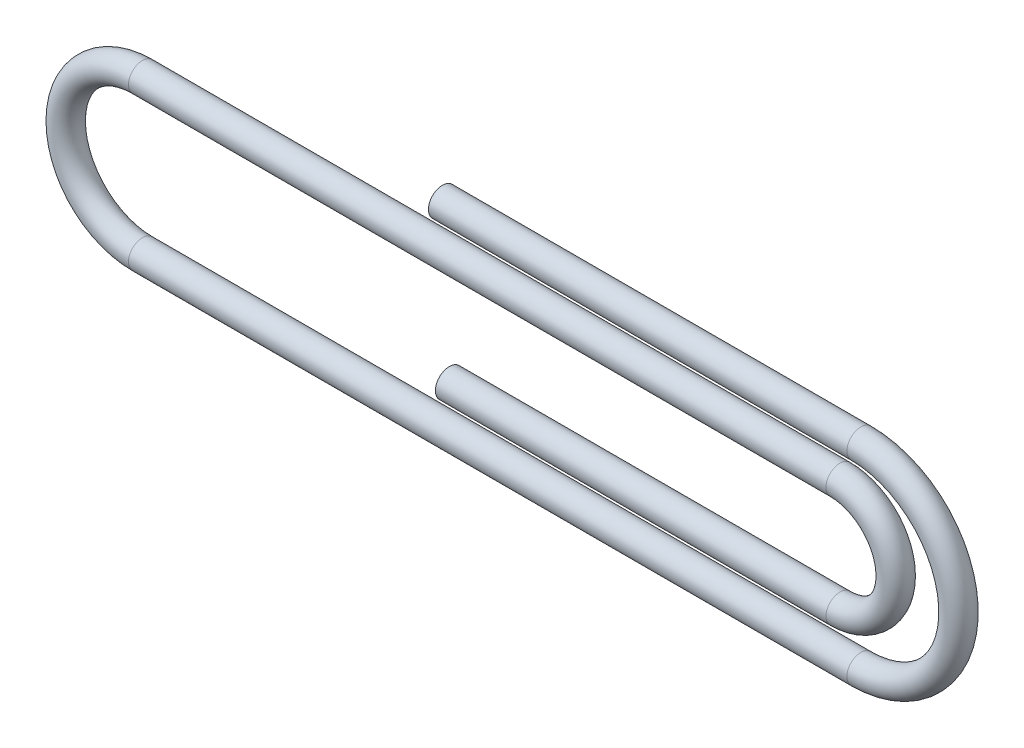
ISO-10303-21;
HEADER;
FILE_DESCRIPTION(('STEP AP214'),'2;1');
FILE_NAME('part.step','',(''),(''),'','','');
FILE_SCHEMA(('AUTOMOTIVE_DESIGN { 1 0 10303 214 1 1 1 1 }'));
ENDSEC;
DATA;
#1=APPLICATION_CONTEXT('core data for automotive mechanical design processes');
#2=APPLICATION_PROTOCOL_DEFINITION('international standard','automotive_design',2000,#1);
#3=PRODUCT_CONTEXT('',#1,'mechanical');
#4=PRODUCT('Part','Part','',(#3));
#5=PRODUCT_RELATED_PRODUCT_CATEGORY('part','',(#4));
#6=PRODUCT_DEFINITION_FORMATION('','',#4);
#7=PRODUCT_DEFINITION_CONTEXT('part definition',#1,'design');
#8=PRODUCT_DEFINITION('design','',#6,#7);
#9=PRODUCT_DEFINITION_SHAPE('','',#8);
#10=(LENGTH_UNIT() NAMED_UNIT(*) SI_UNIT(.MILLI.,.METRE.));
#11=(NAMED_UNIT(*) PLANE_ANGLE_UNIT() SI_UNIT($,.RADIAN.));
#12=(NAMED_UNIT(*) SI_UNIT($,.STERADIAN.) SOLID_ANGLE_UNIT());
#13=UNCERTAINTY_MEASURE_WITH_UNIT(LENGTH_MEASURE(1.E-05),#10,'distance_accuracy_value','');
#14=(GEOMETRIC_REPRESENTATION_CONTEXT(3) GLOBAL_UNCERTAINTY_ASSIGNED_CONTEXT((#13)) GLOBAL_UNIT_ASSIGNED_CONTEXT((#10,
#11,#12)) REPRESENTATION_CONTEXT('',''));
#15=CARTESIAN_POINT('',(0.,0.,0.));
#16=DIRECTION('',(0.,0.,1.));
#17=DIRECTION('',(1.,0.,0.));
#18=AXIS2_PLACEMENT_3D('',#15,#16,#17);
#19=CARTESIAN_POINT('',(0.,0.,0.));
#20=DIRECTION('',(1.,0.,0.));
#21=DIRECTION('',(0.,0.,-1.));
#22=AXIS2_PLACEMENT_3D('',#19,#20,#21);
#23=PLANE('',#22);
#24=CARTESIAN_POINT('',(0.,0.,0.));
#25=DIRECTION('',(1.,0.,0.));
#26=DIRECTION('',(0.,0.,-1.));
#27=AXIS2_PLACEMENT_3D('',#24,#25,#26);
#28=CIRCLE('',#27,0.5);
#29=CARTESIAN_POINT('',(0.,0.,-0.5));
#30=VERTEX_POINT('',#29);
#31=EDGE_CURVE('E76',#30,#30,#28,.T.);
#32=ORIENTED_EDGE('',*,*,#31,.F.);
#33=EDGE_LOOP('',(#32));
#34=FACE_BOUND('',#33,.T.);
#35=ADVANCED_FACE('F41',(#34),#23,.F.);
#36=CARTESIAN_POINT('',(0.250000000000004,-5.5,0.));
#37=DIRECTION('',(-1.,0.,0.));
#38=DIRECTION('',(0.,0.,-1.));
#39=AXIS2_PLACEMENT_3D('',#36,#37,#38);
#40=PLANE('',#39);
#41=CARTESIAN_POINT('',(0.250000000000004,-5.5,0.));
#42=DIRECTION('',(-1.,0.,0.));
#43=DIRECTION('',(0.,0.,-1.));
#44=AXIS2_PLACEMENT_3D('',#41,#42,#43);
#45=CIRCLE('',#44,0.5);
#46=CARTESIAN_POINT('',(0.250000000000004,-5.5,-0.5));
#47=VERTEX_POINT('',#46);
#48=EDGE_CURVE('E10',#47,#47,#45,.T.);
#49=ORIENTED_EDGE('',*,*,#48,.T.);
#50=EDGE_LOOP('',(#49));
#51=FACE_BOUND('',#50,.T.);
#52=ADVANCED_FACE('F84',(#51),#40,.T.);
#53=CARTESIAN_POINT('',(0.,0.,0.));
#54=DIRECTION('',(1.,0.,0.));
#55=DIRECTION('',(0.,0.,-1.));
#56=AXIS2_PLACEMENT_3D('',#53,#54,#55);
#57=CYLINDRICAL_SURFACE('',#56,0.5);
#58=CARTESIAN_POINT('',(15.,0.,0.));
#59=DIRECTION('',(1.,0.,0.));
#60=DIRECTION('',(0.,0.,-1.));
#61=AXIS2_PLACEMENT_3D('',#58,#59,#60);
#62=CIRCLE('',#61,0.5);
#63=CARTESIAN_POINT('',(15.,0.500000000000001,0.));
#64=VERTEX_POINT('',#63);
#65=EDGE_CURVE('E72',#64,#64,#62,.T.);
#66=ORIENTED_EDGE('',*,*,#65,.F.);
#67=EDGE_LOOP('',(#66));
#68=FACE_BOUND('',#67,.T.);
#69=ORIENTED_EDGE('',*,*,#31,.T.);
#70=EDGE_LOOP('',(#69));
#71=FACE_BOUND('',#70,.T.);
#72=ADVANCED_FACE('F81',(#68,#71),#57,.T.);
#73=CARTESIAN_POINT('',(15.,-3.5,0.));
#74=DIRECTION('',(0.,0.,-1.));
#75=DIRECTION('',(-1.,0.,0.));
#76=AXIS2_PLACEMENT_3D('',#73,#74,#75);
#77=TOROIDAL_SURFACE('',#76,3.5,0.5);
#78=CARTESIAN_POINT('',(15.,-7.,0.));
#79=DIRECTION('',(-1.,0.,0.));
#80=DIRECTION('',(0.,0.,-1.));
#81=AXIS2_PLACEMENT_3D('',#78,#79,#80);
#82=CIRCLE('',#81,0.5);
#83=CARTESIAN_POINT('',(15.,-7.5,0.));
#84=VERTEX_POINT('',#83);
#85=EDGE_CURVE('E68',#84,#84,#82,.T.);
#86=CARTESIAN_POINT('',(15.,-3.5,0.));
#87=DIRECTION('',(0.,0.,-1.));
#88=DIRECTION('',(-1.,0.,0.));
#89=AXIS2_PLACEMENT_3D('',#86,#87,#88);
#90=CIRCLE('',#89,4.);
#91=EDGE_CURVE('',#64,#84,#90,.T.);
#92=ORIENTED_EDGE('',*,*,#65,.T.);
#93=ORIENTED_EDGE('',*,*,#85,.F.);
#94=ORIENTED_EDGE('',*,*,#91,.T.);
#95=ORIENTED_EDGE('',*,*,#91,.F.);
#96=EDGE_LOOP('',(#92,#94,#93,#95));
#97=FACE_BOUND('',#96,.T.);
#98=ADVANCED_FACE('F110',(#97),#77,.T.);
#99=CARTESIAN_POINT('',(15.,-7.,0.));
#100=DIRECTION('',(-1.,0.,0.));
#101=DIRECTION('',(0.,-1.,0.));
#102=AXIS2_PLACEMENT_3D('',#99,#100,#101);
#103=CYLINDRICAL_SURFACE('',#102,0.5);
#104=CARTESIAN_POINT('',(-10.75,-7.,0.));
#105=DIRECTION('',(-1.,0.,0.));
#106=DIRECTION('',(0.,0.,-1.));
#107=AXIS2_PLACEMENT_3D('',#104,#105,#106);
#108=CIRCLE('',#107,0.5);
#109=CARTESIAN_POINT('',(-10.75,-7.5,0.));
#110=VERTEX_POINT('',#109);
#111=EDGE_CURVE('E64',#110,#110,#108,.T.);
#112=ORIENTED_EDGE('',*,*,#111,.F.);
#113=EDGE_LOOP('',(#112));
#114=FACE_BOUND('',#113,.T.);
#115=ORIENTED_EDGE('',*,*,#85,.T.);
#116=EDGE_LOOP('',(#115));
#117=FACE_BOUND('',#116,.T.);
#118=ADVANCED_FACE('F106',(#114,#117),#103,.T.);
#119=CARTESIAN_POINT('',(-10.75,-4.25,0.));
#120=DIRECTION('',(0.,0.,-1.));
#121=DIRECTION('',(-1.,0.,0.));
#122=AXIS2_PLACEMENT_3D('',#119,#120,#121);
#123=TOROIDAL_SURFACE('',#122,2.75,0.5);
#124=CARTESIAN_POINT('',(-10.75,-1.5,0.));
#125=DIRECTION('',(1.,0.,0.));
#126=DIRECTION('',(0.,0.,-1.));
#127=AXIS2_PLACEMENT_3D('',#124,#125,#126);
#128=CIRCLE('',#127,0.5);
#129=CARTESIAN_POINT('',(-10.75,-1.,0.));
#130=VERTEX_POINT('',#129);
#131=EDGE_CURVE('E58',#130,#130,#128,.T.);
#132=CARTESIAN_POINT('',(-10.75,-4.25,0.));
#133=DIRECTION('',(0.,0.,-1.));
#134=DIRECTION('',(-1.,0.,0.));
#135=AXIS2_PLACEMENT_3D('',#132,#133,#134);
#136=CIRCLE('',#135,3.25);
#137=EDGE_CURVE('',#110,#130,#136,.T.);
#138=ORIENTED_EDGE('',*,*,#111,.T.);
#139=ORIENTED_EDGE('',*,*,#131,.F.);
#140=ORIENTED_EDGE('',*,*,#137,.T.);
#141=ORIENTED_EDGE('',*,*,#137,.F.);
#142=EDGE_LOOP('',(#138,#140,#139,#141));
#143=FACE_BOUND('',#142,.T.);
#144=ADVANCED_FACE('F102',(#143),#123,.T.);
#145=CARTESIAN_POINT('',(-10.75,-1.5,0.));
#146=DIRECTION('',(1.,0.,0.));
#147=DIRECTION('',(0.,0.,-1.));
#148=AXIS2_PLACEMENT_3D('',#145,#146,#147);
#149=CYLINDRICAL_SURFACE('',#148,0.5);
#150=CARTESIAN_POINT('',(14.25,-1.5,0.));
#151=DIRECTION('',(1.,0.,0.));
#152=DIRECTION('',(0.,0.,-1.));
#153=AXIS2_PLACEMENT_3D('',#150,#151,#152);
#154=CIRCLE('',#153,0.5);
#155=CARTESIAN_POINT('',(14.25,-1.,0.));
#156=VERTEX_POINT('',#155);
#157=EDGE_CURVE('E53',#156,#156,#154,.T.);
#158=ORIENTED_EDGE('',*,*,#157,.F.);
#159=EDGE_LOOP('',(#158));
#160=FACE_BOUND('',#159,.T.);
#161=ORIENTED_EDGE('',*,*,#131,.T.);
#162=EDGE_LOOP('',(#161));
#163=FACE_BOUND('',#162,.T.);
#164=ADVANCED_FACE('F96',(#160,#163),#149,.T.);
#165=CARTESIAN_POINT('',(14.25,-3.5,0.));
#166=DIRECTION('',(0.,0.,-1.));
#167=DIRECTION('',(-1.,0.,0.));
#168=AXIS2_PLACEMENT_3D('',#165,#166,#167);
#169=TOROIDAL_SURFACE('',#168,2.,0.5);
#170=CARTESIAN_POINT('',(14.25,-5.5,0.));
#171=DIRECTION('',(-1.,0.,0.));
#172=DIRECTION('',(0.,0.,-1.));
#173=AXIS2_PLACEMENT_3D('',#170,#171,#172);
#174=CIRCLE('',#173,0.5);
#175=CARTESIAN_POINT('',(14.25,-6.,0.));
#176=VERTEX_POINT('',#175);
#177=EDGE_CURVE('E48',#176,#176,#174,.T.);
#178=CARTESIAN_POINT('',(14.25,-3.5,0.));
#179=DIRECTION('',(0.,0.,-1.));
#180=DIRECTION('',(-1.,0.,0.));
#181=AXIS2_PLACEMENT_3D('',#178,#179,#180);
#182=CIRCLE('',#181,2.5);
#183=EDGE_CURVE('',#156,#176,#182,.T.);
#184=ORIENTED_EDGE('',*,*,#157,.T.);
#185=ORIENTED_EDGE('',*,*,#177,.F.);
#186=ORIENTED_EDGE('',*,*,#183,.T.);
#187=ORIENTED_EDGE('',*,*,#183,.F.);
#188=EDGE_LOOP('',(#184,#186,#185,#187));
#189=FACE_BOUND('',#188,.T.);
#190=ADVANCED_FACE('F90',(#189),#169,.T.);
#191=CARTESIAN_POINT('',(14.25,-5.5,0.));
#192=DIRECTION('',(-1.,0.,0.));
#193=DIRECTION('',(0.,-1.,0.));
#194=AXIS2_PLACEMENT_3D('',#191,#192,#193);
#195=CYLINDRICAL_SURFACE('',#194,0.5);
#196=ORIENTED_EDGE('',*,*,#48,.F.);
#197=EDGE_LOOP('',(#196));
#198=FACE_BOUND('',#197,.T.);
#199=ORIENTED_EDGE('',*,*,#177,.T.);
#200=EDGE_LOOP('',(#199));
#201=FACE_BOUND('',#200,.T.);
#202=ADVANCED_FACE('F88',(#198,#201),#195,.T.);
#203=CLOSED_SHELL('',(#35,#52,#72,#98,#118,#144,#164,#190,#202));
#204=MANIFOLD_SOLID_BREP('B2',#203);
#205=ADVANCED_BREP_SHAPE_REPRESENTATION('',(#18,#204),#14);
#206=SHAPE_DEFINITION_REPRESENTATION(#9,#205);
ENDSEC;
END-ISO-10303-21;
